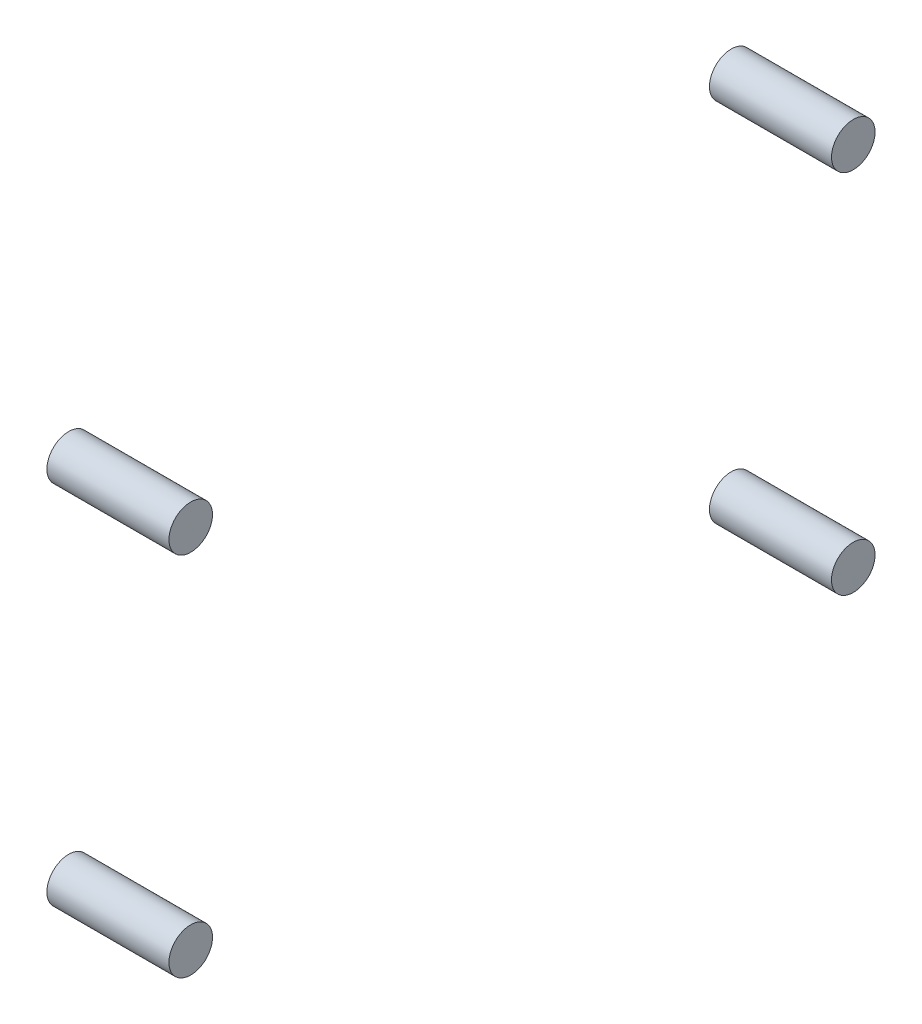
ISO-10303-21;
HEADER;
FILE_DESCRIPTION(('STEP AP214'),'2;1');
FILE_NAME('part.step','',(''),(''),'','','');
FILE_SCHEMA(('AUTOMOTIVE_DESIGN { 1 0 10303 214 1 1 1 1 }'));
ENDSEC;
DATA;
#1=APPLICATION_CONTEXT('core data for automotive mechanical design processes');
#2=APPLICATION_PROTOCOL_DEFINITION('international standard','automotive_design',2000,#1);
#3=PRODUCT_CONTEXT('',#1,'mechanical');
#4=PRODUCT('Part','Part','',(#3));
#5=PRODUCT_RELATED_PRODUCT_CATEGORY('part','',(#4));
#6=PRODUCT_DEFINITION_FORMATION('','',#4);
#7=PRODUCT_DEFINITION_CONTEXT('part definition',#1,'design');
#8=PRODUCT_DEFINITION('design','',#6,#7);
#9=PRODUCT_DEFINITION_SHAPE('','',#8);
#10=(LENGTH_UNIT() NAMED_UNIT(*) SI_UNIT(.MILLI.,.METRE.));
#11=(NAMED_UNIT(*) PLANE_ANGLE_UNIT() SI_UNIT($,.RADIAN.));
#12=(NAMED_UNIT(*) SI_UNIT($,.STERADIAN.) SOLID_ANGLE_UNIT());
#13=UNCERTAINTY_MEASURE_WITH_UNIT(LENGTH_MEASURE(1.E-05),#10,'distance_accuracy_value','');
#14=(GEOMETRIC_REPRESENTATION_CONTEXT(3) GLOBAL_UNCERTAINTY_ASSIGNED_CONTEXT((#13)) GLOBAL_UNIT_ASSIGNED_CONTEXT((#10,
#11,#12)) REPRESENTATION_CONTEXT('',''));
#15=CARTESIAN_POINT('',(0.,0.,0.));
#16=DIRECTION('',(0.,0.,1.));
#17=DIRECTION('',(1.,0.,0.));
#18=AXIS2_PLACEMENT_3D('',#15,#16,#17);
#19=CARTESIAN_POINT('',(-7.,-14.5737084990357,-37.8899999999998));
#20=DIRECTION('',(1.,0.,0.));
#21=DIRECTION('',(0.,0.,-1.));
#22=AXIS2_PLACEMENT_3D('',#19,#20,#21);
#23=CYLINDRICAL_SURFACE('',#22,1.25);
#24=CARTESIAN_POINT('',(-7.,-14.5737084990357,-37.8899999999998));
#25=DIRECTION('',(1.,0.,0.));
#26=DIRECTION('',(0.,0.,-1.));
#27=AXIS2_PLACEMENT_3D('',#24,#25,#26);
#28=CIRCLE('',#27,1.25);
#29=CARTESIAN_POINT('',(-7.,-14.5737084990357,-39.1399999999998));
#30=VERTEX_POINT('',#29);
#31=EDGE_CURVE('E12',#30,#30,#28,.T.);
#32=ORIENTED_EDGE('',*,*,#31,.T.);
#33=EDGE_LOOP('',(#32));
#34=FACE_BOUND('',#33,.T.);
#35=CARTESIAN_POINT('',(0.,-14.5737084990357,-37.8899999999998));
#36=DIRECTION('',(1.,0.,0.));
#37=DIRECTION('',(0.,0.,-1.));
#38=AXIS2_PLACEMENT_3D('',#35,#36,#37);
#39=CIRCLE('',#38,1.25);
#40=CARTESIAN_POINT('',(0.,-14.5737084990357,-39.1399999999998));
#41=VERTEX_POINT('',#40);
#42=EDGE_CURVE('E47',#41,#41,#39,.T.);
#43=ORIENTED_EDGE('',*,*,#42,.F.);
#44=EDGE_LOOP('',(#43));
#45=FACE_BOUND('',#44,.T.);
#46=ADVANCED_FACE('F44',(#34,#45),#23,.T.);
#47=CARTESIAN_POINT('',(-7.,-14.5737084990357,-37.8899999999998));
#48=DIRECTION('',(1.,0.,0.));
#49=DIRECTION('',(0.,0.,-1.));
#50=AXIS2_PLACEMENT_3D('',#47,#48,#49);
#51=PLANE('',#50);
#52=CARTESIAN_POINT('',(-7.,-14.5737084990357,-37.8899999999998));
#53=DIRECTION('',(-1.,0.,0.));
#54=DIRECTION('',(0.,0.,1.));
#55=AXIS2_PLACEMENT_3D('',#52,#53,#54);
#56=CIRCLE('',#55,1.0414);
#57=CARTESIAN_POINT('',(-7.,-14.5737084990357,-36.8485999999998));
#58=VERTEX_POINT('',#57);
#59=EDGE_CURVE('E63',#58,#58,#56,.T.);
#60=ORIENTED_EDGE('',*,*,#59,.F.);
#61=EDGE_LOOP('',(#60));
#62=FACE_BOUND('',#61,.T.);
#63=ORIENTED_EDGE('',*,*,#31,.F.);
#64=EDGE_LOOP('',(#63));
#65=FACE_BOUND('',#64,.T.);
#66=ADVANCED_FACE('F71',(#62,#65),#51,.F.);
#67=CARTESIAN_POINT('',(0.,-14.5737084990357,-37.8899999999998));
#68=DIRECTION('',(1.,0.,0.));
#69=DIRECTION('',(0.,0.,-1.));
#70=AXIS2_PLACEMENT_3D('',#67,#68,#69);
#71=PLANE('',#70);
#72=ORIENTED_EDGE('',*,*,#42,.T.);
#73=EDGE_LOOP('',(#72));
#74=FACE_BOUND('',#73,.T.);
#75=ADVANCED_FACE('F57',(#74),#71,.T.);
#76=CARTESIAN_POINT('',(-1.6257362486553,-14.5737084990357,-37.8899999999998));
#77=DIRECTION('',(-1.,0.,0.));
#78=DIRECTION('',(0.,0.,1.));
#79=AXIS2_PLACEMENT_3D('',#76,#77,#78);
#80=CONICAL_SURFACE('',#79,1.0414,1.02974425867665);
#81=CARTESIAN_POINT('',(-1.,-14.5737084990357,-37.8899999999998));
#82=VERTEX_POINT('',#81);
#83=VERTEX_LOOP('',#82);
#84=FACE_BOUND('',#83,.T.);
#85=CARTESIAN_POINT('',(-1.6257362486553,-14.5737084990357,-37.8899999999998));
#86=DIRECTION('',(-1.,0.,0.));
#87=DIRECTION('',(0.,0.,1.));
#88=AXIS2_PLACEMENT_3D('',#85,#86,#87);
#89=CIRCLE('',#88,1.0414);
#90=CARTESIAN_POINT('',(-1.6257362486553,-14.5737084990357,-36.8485999999998));
#91=VERTEX_POINT('',#90);
#92=EDGE_CURVE('E61',#91,#91,#89,.T.);
#93=ORIENTED_EDGE('',*,*,#92,.T.);
#94=EDGE_LOOP('',(#93));
#95=FACE_BOUND('',#94,.T.);
#96=ADVANCED_FACE('F53',(#84,#95),#80,.F.);
#97=CARTESIAN_POINT('',(-7.,-14.5737084990357,-37.8899999999998));
#98=DIRECTION('',(-1.,0.,0.));
#99=DIRECTION('',(0.,0.,1.));
#100=AXIS2_PLACEMENT_3D('',#97,#98,#99);
#101=CYLINDRICAL_SURFACE('',#100,1.0414);
#102=ORIENTED_EDGE('',*,*,#92,.F.);
#103=EDGE_LOOP('',(#102));
#104=FACE_BOUND('',#103,.T.);
#105=ORIENTED_EDGE('',*,*,#59,.T.);
#106=EDGE_LOOP('',(#105));
#107=FACE_BOUND('',#106,.T.);
#108=ADVANCED_FACE('F56',(#104,#107),#101,.F.);
#109=CLOSED_SHELL('',(#46,#66,#75,#96,#108));
#110=MANIFOLD_SOLID_BREP('B2',#109);
#111=CARTESIAN_POINT('',(-7.,-14.5737084990365,-75.8899999999998));
#112=DIRECTION('',(1.,0.,0.));
#113=DIRECTION('',(0.,0.,-1.));
#114=AXIS2_PLACEMENT_3D('',#111,#112,#113);
#115=CYLINDRICAL_SURFACE('',#114,1.25);
#116=CARTESIAN_POINT('',(-7.,-14.5737084990365,-75.8899999999998));
#117=DIRECTION('',(1.,0.,0.));
#118=DIRECTION('',(0.,0.,-1.));
#119=AXIS2_PLACEMENT_3D('',#116,#117,#118);
#120=CIRCLE('',#119,1.25);
#121=CARTESIAN_POINT('',(-7.,-14.5737084990365,-77.1399999999998));
#122=VERTEX_POINT('',#121);
#123=EDGE_CURVE('E42',#122,#122,#120,.T.);
#124=ORIENTED_EDGE('',*,*,#123,.T.);
#125=EDGE_LOOP('',(#124));
#126=FACE_BOUND('',#125,.T.);
#127=CARTESIAN_POINT('',(0.,-14.5737084990365,-75.8899999999998));
#128=DIRECTION('',(1.,0.,0.));
#129=DIRECTION('',(0.,0.,-1.));
#130=AXIS2_PLACEMENT_3D('',#127,#128,#129);
#131=CIRCLE('',#130,1.25);
#132=CARTESIAN_POINT('',(0.,-14.5737084990365,-77.1399999999998));
#133=VERTEX_POINT('',#132);
#134=EDGE_CURVE('E130',#133,#133,#131,.T.);
#135=ORIENTED_EDGE('',*,*,#134,.F.);
#136=EDGE_LOOP('',(#135));
#137=FACE_BOUND('',#136,.T.);
#138=ADVANCED_FACE('F127',(#126,#137),#115,.T.);
#139=CARTESIAN_POINT('',(-7.,-14.5737084990365,-75.8899999999998));
#140=DIRECTION('',(1.,0.,0.));
#141=DIRECTION('',(0.,0.,-1.));
#142=AXIS2_PLACEMENT_3D('',#139,#140,#141);
#143=PLANE('',#142);
#144=CARTESIAN_POINT('',(-7.,-14.5737084990365,-75.8899999999998));
#145=DIRECTION('',(-1.,0.,0.));
#146=DIRECTION('',(0.,0.,1.));
#147=AXIS2_PLACEMENT_3D('',#144,#145,#146);
#148=CIRCLE('',#147,1.0414);
#149=CARTESIAN_POINT('',(-7.,-14.5737084990365,-74.8485999999998));
#150=VERTEX_POINT('',#149);
#151=EDGE_CURVE('E146',#150,#150,#148,.T.);
#152=ORIENTED_EDGE('',*,*,#151,.F.);
#153=EDGE_LOOP('',(#152));
#154=FACE_BOUND('',#153,.T.);
#155=ORIENTED_EDGE('',*,*,#123,.F.);
#156=EDGE_LOOP('',(#155));
#157=FACE_BOUND('',#156,.T.);
#158=ADVANCED_FACE('F154',(#154,#157),#143,.F.);
#159=CARTESIAN_POINT('',(0.,-14.5737084990365,-75.8899999999998));
#160=DIRECTION('',(1.,0.,0.));
#161=DIRECTION('',(0.,0.,-1.));
#162=AXIS2_PLACEMENT_3D('',#159,#160,#161);
#163=PLANE('',#162);
#164=ORIENTED_EDGE('',*,*,#134,.T.);
#165=EDGE_LOOP('',(#164));
#166=FACE_BOUND('',#165,.T.);
#167=ADVANCED_FACE('F140',(#166),#163,.T.);
#168=CARTESIAN_POINT('',(-1.6257362486553,-14.5737084990365,-75.8899999999998));
#169=DIRECTION('',(-1.,0.,0.));
#170=DIRECTION('',(0.,0.,1.));
#171=AXIS2_PLACEMENT_3D('',#168,#169,#170);
#172=CONICAL_SURFACE('',#171,1.0414,1.02974425867665);
#173=CARTESIAN_POINT('',(-1.,-14.5737084990365,-75.8899999999998));
#174=VERTEX_POINT('',#173);
#175=VERTEX_LOOP('',#174);
#176=FACE_BOUND('',#175,.T.);
#177=CARTESIAN_POINT('',(-1.6257362486553,-14.5737084990365,-75.8899999999998));
#178=DIRECTION('',(-1.,0.,0.));
#179=DIRECTION('',(0.,0.,1.));
#180=AXIS2_PLACEMENT_3D('',#177,#178,#179);
#181=CIRCLE('',#180,1.0414);
#182=CARTESIAN_POINT('',(-1.6257362486553,-14.5737084990365,-74.8485999999998));
#183=VERTEX_POINT('',#182);
#184=EDGE_CURVE('E144',#183,#183,#181,.T.);
#185=ORIENTED_EDGE('',*,*,#184,.T.);
#186=EDGE_LOOP('',(#185));
#187=FACE_BOUND('',#186,.T.);
#188=ADVANCED_FACE('F136',(#176,#187),#172,.F.);
#189=CARTESIAN_POINT('',(-7.,-14.5737084990365,-75.8899999999998));
#190=DIRECTION('',(-1.,0.,0.));
#191=DIRECTION('',(0.,0.,1.));
#192=AXIS2_PLACEMENT_3D('',#189,#190,#191);
#193=CYLINDRICAL_SURFACE('',#192,1.0414);
#194=ORIENTED_EDGE('',*,*,#184,.F.);
#195=EDGE_LOOP('',(#194));
#196=FACE_BOUND('',#195,.T.);
#197=ORIENTED_EDGE('',*,*,#151,.T.);
#198=EDGE_LOOP('',(#197));
#199=FACE_BOUND('',#198,.T.);
#200=ADVANCED_FACE('F139',(#196,#199),#193,.F.);
#201=CLOSED_SHELL('',(#138,#158,#167,#188,#200));
#202=MANIFOLD_SOLID_BREP('B6',#201);
#203=CARTESIAN_POINT('',(-7.,6.42629150096429,-37.8900000000004));
#204=DIRECTION('',(1.,0.,0.));
#205=DIRECTION('',(0.,0.,-1.));
#206=AXIS2_PLACEMENT_3D('',#203,#204,#205);
#207=CYLINDRICAL_SURFACE('',#206,1.25);
#208=CARTESIAN_POINT('',(-7.,6.42629150096429,-37.8900000000004));
#209=DIRECTION('',(1.,0.,0.));
#210=DIRECTION('',(0.,0.,-1.));
#211=AXIS2_PLACEMENT_3D('',#208,#209,#210);
#212=CIRCLE('',#211,1.25);
#213=CARTESIAN_POINT('',(-7.,6.42629150096429,-39.1400000000005));
#214=VERTEX_POINT('',#213);
#215=EDGE_CURVE('E125',#214,#214,#212,.T.);
#216=ORIENTED_EDGE('',*,*,#215,.T.);
#217=EDGE_LOOP('',(#216));
#218=FACE_BOUND('',#217,.T.);
#219=CARTESIAN_POINT('',(0.,6.42629150096429,-37.8900000000004));
#220=DIRECTION('',(1.,0.,0.));
#221=DIRECTION('',(0.,0.,-1.));
#222=AXIS2_PLACEMENT_3D('',#219,#220,#221);
#223=CIRCLE('',#222,1.25);
#224=CARTESIAN_POINT('',(0.,6.42629150096429,-39.1400000000005));
#225=VERTEX_POINT('',#224);
#226=EDGE_CURVE('E212',#225,#225,#223,.T.);
#227=ORIENTED_EDGE('',*,*,#226,.F.);
#228=EDGE_LOOP('',(#227));
#229=FACE_BOUND('',#228,.T.);
#230=ADVANCED_FACE('F209',(#218,#229),#207,.T.);
#231=CARTESIAN_POINT('',(-7.,6.42629150096429,-37.8900000000004));
#232=DIRECTION('',(1.,0.,0.));
#233=DIRECTION('',(0.,0.,-1.));
#234=AXIS2_PLACEMENT_3D('',#231,#232,#233);
#235=PLANE('',#234);
#236=CARTESIAN_POINT('',(-7.,6.42629150096429,-37.8900000000004));
#237=DIRECTION('',(-1.,0.,0.));
#238=DIRECTION('',(0.,0.,1.));
#239=AXIS2_PLACEMENT_3D('',#236,#237,#238);
#240=CIRCLE('',#239,1.0414);
#241=CARTESIAN_POINT('',(-7.,6.42629150096429,-36.8486000000005));
#242=VERTEX_POINT('',#241);
#243=EDGE_CURVE('E228',#242,#242,#240,.T.);
#244=ORIENTED_EDGE('',*,*,#243,.F.);
#245=EDGE_LOOP('',(#244));
#246=FACE_BOUND('',#245,.T.);
#247=ORIENTED_EDGE('',*,*,#215,.F.);
#248=EDGE_LOOP('',(#247));
#249=FACE_BOUND('',#248,.T.);
#250=ADVANCED_FACE('F236',(#246,#249),#235,.F.);
#251=CARTESIAN_POINT('',(0.,6.42629150096429,-37.8900000000004));
#252=DIRECTION('',(1.,0.,0.));
#253=DIRECTION('',(0.,0.,-1.));
#254=AXIS2_PLACEMENT_3D('',#251,#252,#253);
#255=PLANE('',#254);
#256=ORIENTED_EDGE('',*,*,#226,.T.);
#257=EDGE_LOOP('',(#256));
#258=FACE_BOUND('',#257,.T.);
#259=ADVANCED_FACE('F222',(#258),#255,.T.);
#260=CARTESIAN_POINT('',(-1.6257362486553,6.42629150096429,-37.8900000000004));
#261=DIRECTION('',(-1.,0.,0.));
#262=DIRECTION('',(0.,0.,1.));
#263=AXIS2_PLACEMENT_3D('',#260,#261,#262);
#264=CONICAL_SURFACE('',#263,1.0414,1.02974425867665);
#265=CARTESIAN_POINT('',(-1.,6.42629150096429,-37.8900000000004));
#266=VERTEX_POINT('',#265);
#267=VERTEX_LOOP('',#266);
#268=FACE_BOUND('',#267,.T.);
#269=CARTESIAN_POINT('',(-1.6257362486553,6.42629150096429,-37.8900000000004));
#270=DIRECTION('',(-1.,0.,0.));
#271=DIRECTION('',(0.,0.,1.));
#272=AXIS2_PLACEMENT_3D('',#269,#270,#271);
#273=CIRCLE('',#272,1.0414);
#274=CARTESIAN_POINT('',(-1.6257362486553,6.42629150096429,-36.8486000000005));
#275=VERTEX_POINT('',#274);
#276=EDGE_CURVE('E226',#275,#275,#273,.T.);
#277=ORIENTED_EDGE('',*,*,#276,.T.);
#278=EDGE_LOOP('',(#277));
#279=FACE_BOUND('',#278,.T.);
#280=ADVANCED_FACE('F218',(#268,#279),#264,.F.);
#281=CARTESIAN_POINT('',(-7.,6.42629150096429,-37.8900000000004));
#282=DIRECTION('',(-1.,0.,0.));
#283=DIRECTION('',(0.,0.,1.));
#284=AXIS2_PLACEMENT_3D('',#281,#282,#283);
#285=CYLINDRICAL_SURFACE('',#284,1.0414);
#286=ORIENTED_EDGE('',*,*,#276,.F.);
#287=EDGE_LOOP('',(#286));
#288=FACE_BOUND('',#287,.T.);
#289=ORIENTED_EDGE('',*,*,#243,.T.);
#290=EDGE_LOOP('',(#289));
#291=FACE_BOUND('',#290,.T.);
#292=ADVANCED_FACE('F221',(#288,#291),#285,.F.);
#293=CLOSED_SHELL('',(#230,#250,#259,#280,#292));
#294=MANIFOLD_SOLID_BREP('B36',#293);
#295=CARTESIAN_POINT('',(-7.,6.42629150096429,-75.8899999999998));
#296=DIRECTION('',(1.,0.,0.));
#297=DIRECTION('',(0.,0.,-1.));
#298=AXIS2_PLACEMENT_3D('',#295,#296,#297);
#299=CYLINDRICAL_SURFACE('',#298,1.25);
#300=CARTESIAN_POINT('',(-7.,6.42629150096429,-75.8899999999998));
#301=DIRECTION('',(1.,0.,0.));
#302=DIRECTION('',(0.,0.,-1.));
#303=AXIS2_PLACEMENT_3D('',#300,#301,#302);
#304=CIRCLE('',#303,1.25);
#305=CARTESIAN_POINT('',(-7.,6.42629150096429,-77.1399999999998));
#306=VERTEX_POINT('',#305);
#307=EDGE_CURVE('E207',#306,#306,#304,.T.);
#308=ORIENTED_EDGE('',*,*,#307,.T.);
#309=EDGE_LOOP('',(#308));
#310=FACE_BOUND('',#309,.T.);
#311=CARTESIAN_POINT('',(0.,6.42629150096429,-75.8899999999998));
#312=DIRECTION('',(1.,0.,0.));
#313=DIRECTION('',(0.,0.,-1.));
#314=AXIS2_PLACEMENT_3D('',#311,#312,#313);
#315=CIRCLE('',#314,1.25);
#316=CARTESIAN_POINT('',(0.,6.42629150096429,-77.1399999999998));
#317=VERTEX_POINT('',#316);
#318=EDGE_CURVE('E285',#317,#317,#315,.T.);
#319=ORIENTED_EDGE('',*,*,#318,.F.);
#320=EDGE_LOOP('',(#319));
#321=FACE_BOUND('',#320,.T.);
#322=ADVANCED_FACE('F282',(#310,#321),#299,.T.);
#323=CARTESIAN_POINT('',(-7.,6.42629150096429,-75.8899999999998));
#324=DIRECTION('',(1.,0.,0.));
#325=DIRECTION('',(0.,0.,-1.));
#326=AXIS2_PLACEMENT_3D('',#323,#324,#325);
#327=PLANE('',#326);
#328=CARTESIAN_POINT('',(-7.,6.42629150096429,-75.8899999999998));
#329=DIRECTION('',(-1.,0.,0.));
#330=DIRECTION('',(0.,0.,1.));
#331=AXIS2_PLACEMENT_3D('',#328,#329,#330);
#332=CIRCLE('',#331,1.0414);
#333=CARTESIAN_POINT('',(-7.,6.42629150096429,-74.8485999999998));
#334=VERTEX_POINT('',#333);
#335=EDGE_CURVE('E301',#334,#334,#332,.T.);
#336=ORIENTED_EDGE('',*,*,#335,.F.);
#337=EDGE_LOOP('',(#336));
#338=FACE_BOUND('',#337,.T.);
#339=ORIENTED_EDGE('',*,*,#307,.F.);
#340=EDGE_LOOP('',(#339));
#341=FACE_BOUND('',#340,.T.);
#342=ADVANCED_FACE('F309',(#338,#341),#327,.F.);
#343=CARTESIAN_POINT('',(0.,6.42629150096429,-75.8899999999998));
#344=DIRECTION('',(1.,0.,0.));
#345=DIRECTION('',(0.,0.,-1.));
#346=AXIS2_PLACEMENT_3D('',#343,#344,#345);
#347=PLANE('',#346);
#348=ORIENTED_EDGE('',*,*,#318,.T.);
#349=EDGE_LOOP('',(#348));
#350=FACE_BOUND('',#349,.T.);
#351=ADVANCED_FACE('F295',(#350),#347,.T.);
#352=CARTESIAN_POINT('',(-1.6257362486553,6.42629150096429,-75.8899999999998));
#353=DIRECTION('',(-1.,0.,0.));
#354=DIRECTION('',(0.,0.,1.));
#355=AXIS2_PLACEMENT_3D('',#352,#353,#354);
#356=CONICAL_SURFACE('',#355,1.0414,1.02974425867665);
#357=CARTESIAN_POINT('',(-1.,6.42629150096429,-75.8899999999998));
#358=VERTEX_POINT('',#357);
#359=VERTEX_LOOP('',#358);
#360=FACE_BOUND('',#359,.T.);
#361=CARTESIAN_POINT('',(-1.6257362486553,6.42629150096429,-75.8899999999998));
#362=DIRECTION('',(-1.,0.,0.));
#363=DIRECTION('',(0.,0.,1.));
#364=AXIS2_PLACEMENT_3D('',#361,#362,#363);
#365=CIRCLE('',#364,1.0414);
#366=CARTESIAN_POINT('',(-1.6257362486553,6.42629150096429,-74.8485999999998));
#367=VERTEX_POINT('',#366);
#368=EDGE_CURVE('E299',#367,#367,#365,.T.);
#369=ORIENTED_EDGE('',*,*,#368,.T.);
#370=EDGE_LOOP('',(#369));
#371=FACE_BOUND('',#370,.T.);
#372=ADVANCED_FACE('F291',(#360,#371),#356,.F.);
#373=CARTESIAN_POINT('',(-7.,6.42629150096429,-75.8899999999998));
#374=DIRECTION('',(-1.,0.,0.));
#375=DIRECTION('',(0.,0.,1.));
#376=AXIS2_PLACEMENT_3D('',#373,#374,#375);
#377=CYLINDRICAL_SURFACE('',#376,1.0414);
#378=ORIENTED_EDGE('',*,*,#368,.F.);
#379=EDGE_LOOP('',(#378));
#380=FACE_BOUND('',#379,.T.);
#381=ORIENTED_EDGE('',*,*,#335,.T.);
#382=EDGE_LOOP('',(#381));
#383=FACE_BOUND('',#382,.T.);
#384=ADVANCED_FACE('F294',(#380,#383),#377,.F.);
#385=CLOSED_SHELL('',(#322,#342,#351,#372,#384));
#386=MANIFOLD_SOLID_BREP('B119',#385);
#387=ADVANCED_BREP_SHAPE_REPRESENTATION('',(#18,#110,#202,#294,#386),#14);
#388=SHAPE_DEFINITION_REPRESENTATION(#9,#387);
ENDSEC;
END-ISO-10303-21;
